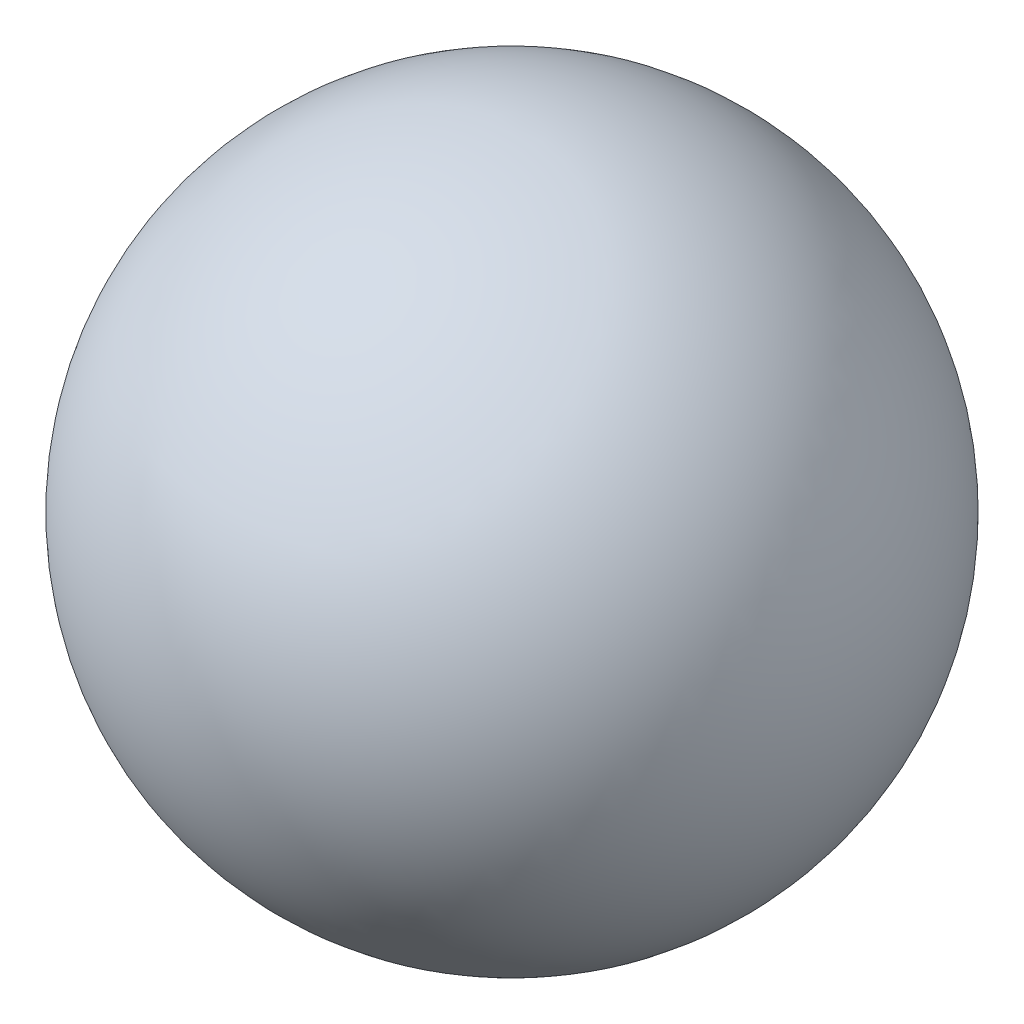
ISO-10303-21;
HEADER;
FILE_DESCRIPTION(('STEP AP214'),'2;1');
FILE_NAME('part.step','',(''),(''),'','','');
FILE_SCHEMA(('AUTOMOTIVE_DESIGN { 1 0 10303 214 1 1 1 1 }'));
ENDSEC;
DATA;
#1=APPLICATION_CONTEXT('core data for automotive mechanical design processes');
#2=APPLICATION_PROTOCOL_DEFINITION('international standard','automotive_design',2000,#1);
#3=PRODUCT_CONTEXT('',#1,'mechanical');
#4=PRODUCT('Part','Part','',(#3));
#5=PRODUCT_RELATED_PRODUCT_CATEGORY('part','',(#4));
#6=PRODUCT_DEFINITION_FORMATION('','',#4);
#7=PRODUCT_DEFINITION_CONTEXT('part definition',#1,'design');
#8=PRODUCT_DEFINITION('design','',#6,#7);
#9=PRODUCT_DEFINITION_SHAPE('','',#8);
#10=(LENGTH_UNIT() NAMED_UNIT(*) SI_UNIT(.MILLI.,.METRE.));
#11=(NAMED_UNIT(*) PLANE_ANGLE_UNIT() SI_UNIT($,.RADIAN.));
#12=(NAMED_UNIT(*) SI_UNIT($,.STERADIAN.) SOLID_ANGLE_UNIT());
#13=UNCERTAINTY_MEASURE_WITH_UNIT(LENGTH_MEASURE(1.E-05),#10,'distance_accuracy_value','');
#14=(GEOMETRIC_REPRESENTATION_CONTEXT(3) GLOBAL_UNCERTAINTY_ASSIGNED_CONTEXT((#13)) GLOBAL_UNIT_ASSIGNED_CONTEXT((#10,
#11,#12)) REPRESENTATION_CONTEXT('',''));
#15=CARTESIAN_POINT('',(0.,0.,0.));
#16=DIRECTION('',(0.,0.,1.));
#17=DIRECTION('',(1.,0.,0.));
#18=AXIS2_PLACEMENT_3D('',#15,#16,#17);
#19=CARTESIAN_POINT('',(0.,0.,0.));
#20=DIRECTION('',(0.,1.,0.));
#21=DIRECTION('',(0.,0.,1.));
#22=AXIS2_PLACEMENT_3D('',#19,#20,#21);
#23=SPHERICAL_SURFACE('',#22,4.);
#24=CARTESIAN_POINT('',(0.,4.,0.));
#25=VERTEX_POINT('',#24);
#26=VERTEX_LOOP('',#25);
#27=FACE_BOUND('',#26,.T.);
#28=ADVANCED_FACE('F39',(#27),#23,.T.);
#29=CLOSED_SHELL('',(#28));
#30=MANIFOLD_SOLID_BREP('B2',#29);
#31=ADVANCED_BREP_SHAPE_REPRESENTATION('',(#18,#30),#14);
#32=SHAPE_DEFINITION_REPRESENTATION(#9,#31);
ENDSEC;
END-ISO-10303-21;
